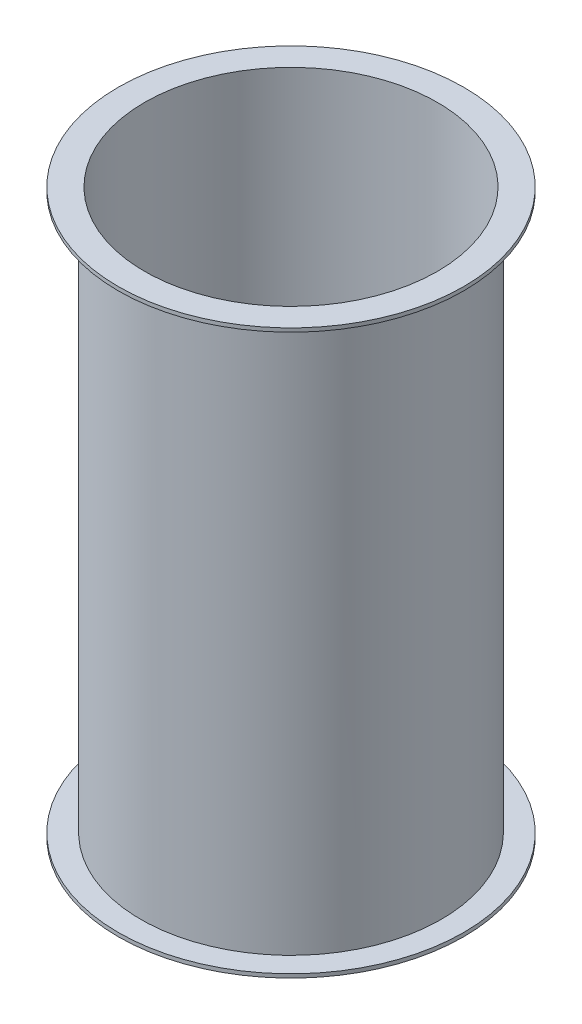
ISO-10303-21;
HEADER;
FILE_DESCRIPTION(('STEP AP214'),'2;1');
FILE_NAME('part.step','',(''),(''),'','','');
FILE_SCHEMA(('AUTOMOTIVE_DESIGN { 1 0 10303 214 1 1 1 1 }'));
ENDSEC;
DATA;
#1=APPLICATION_CONTEXT('core data for automotive mechanical design processes');
#2=APPLICATION_PROTOCOL_DEFINITION('international standard','automotive_design',2000,#1);
#3=PRODUCT_CONTEXT('',#1,'mechanical');
#4=PRODUCT('Part','Part','',(#3));
#5=PRODUCT_RELATED_PRODUCT_CATEGORY('part','',(#4));
#6=PRODUCT_DEFINITION_FORMATION('','',#4);
#7=PRODUCT_DEFINITION_CONTEXT('part definition',#1,'design');
#8=PRODUCT_DEFINITION('design','',#6,#7);
#9=PRODUCT_DEFINITION_SHAPE('','',#8);
#10=(LENGTH_UNIT() NAMED_UNIT(*) SI_UNIT(.MILLI.,.METRE.));
#11=(NAMED_UNIT(*) PLANE_ANGLE_UNIT() SI_UNIT($,.RADIAN.));
#12=(NAMED_UNIT(*) SI_UNIT($,.STERADIAN.) SOLID_ANGLE_UNIT());
#13=UNCERTAINTY_MEASURE_WITH_UNIT(LENGTH_MEASURE(1.E-05),#10,'distance_accuracy_value','');
#14=(GEOMETRIC_REPRESENTATION_CONTEXT(3) GLOBAL_UNCERTAINTY_ASSIGNED_CONTEXT((#13)) GLOBAL_UNIT_ASSIGNED_CONTEXT((#10,
#11,#12)) REPRESENTATION_CONTEXT('',''));
#15=CARTESIAN_POINT('',(0.,0.,0.));
#16=DIRECTION('',(0.,0.,1.));
#17=DIRECTION('',(1.,0.,0.));
#18=AXIS2_PLACEMENT_3D('',#15,#16,#17);
#19=CARTESIAN_POINT('',(0.,150.,0.));
#20=DIRECTION('',(0.,-1.,0.));
#21=DIRECTION('',(0.,0.,-1.));
#22=AXIS2_PLACEMENT_3D('',#19,#20,#21);
#23=CYLINDRICAL_SURFACE('',#22,40.);
#24=CARTESIAN_POINT('',(0.,149.,0.));
#25=DIRECTION('',(0.,1.,0.));
#26=DIRECTION('',(0.,0.,1.));
#27=AXIS2_PLACEMENT_3D('',#24,#25,#26);
#28=CIRCLE('',#27,40.);
#29=CARTESIAN_POINT('',(0.,149.,40.));
#30=VERTEX_POINT('',#29);
#31=EDGE_CURVE('E43',#30,#30,#28,.T.);
#32=ORIENTED_EDGE('',*,*,#31,.F.);
#33=EDGE_LOOP('',(#32));
#34=FACE_BOUND('',#33,.T.);
#35=CARTESIAN_POINT('',(0.,1.,0.));
#36=DIRECTION('',(0.,-1.,0.));
#37=DIRECTION('',(0.,0.,-1.));
#38=AXIS2_PLACEMENT_3D('',#35,#36,#37);
#39=CIRCLE('',#38,40.);
#40=CARTESIAN_POINT('',(0.,1.,-40.));
#41=VERTEX_POINT('',#40);
#42=EDGE_CURVE('E11',#41,#41,#39,.T.);
#43=ORIENTED_EDGE('',*,*,#42,.F.);
#44=EDGE_LOOP('',(#43));
#45=FACE_BOUND('',#44,.T.);
#46=ADVANCED_FACE('F37',(#34,#45),#23,.T.);
#47=CARTESIAN_POINT('',(0.,150.,0.));
#48=DIRECTION('',(0.,1.,0.));
#49=DIRECTION('',(0.,0.,1.));
#50=AXIS2_PLACEMENT_3D('',#47,#48,#49);
#51=PLANE('',#50);
#52=CARTESIAN_POINT('',(0.,150.,0.));
#53=DIRECTION('',(0.,1.,0.));
#54=DIRECTION('',(1.,0.,0.));
#55=AXIS2_PLACEMENT_3D('',#52,#53,#54);
#56=CIRCLE('',#55,39.);
#57=CARTESIAN_POINT('',(39.,150.,0.));
#58=VERTEX_POINT('',#57);
#59=EDGE_CURVE('E47',#58,#58,#56,.T.);
#60=ORIENTED_EDGE('',*,*,#59,.F.);
#61=EDGE_LOOP('',(#60));
#62=FACE_BOUND('',#61,.T.);
#63=CARTESIAN_POINT('',(0.,150.,0.));
#64=DIRECTION('',(0.,1.,0.));
#65=DIRECTION('',(0.,0.,1.));
#66=AXIS2_PLACEMENT_3D('',#63,#64,#65);
#67=CIRCLE('',#66,46.);
#68=CARTESIAN_POINT('',(0.,150.,46.));
#69=VERTEX_POINT('',#68);
#70=EDGE_CURVE('E57',#69,#69,#67,.T.);
#71=ORIENTED_EDGE('',*,*,#70,.T.);
#72=EDGE_LOOP('',(#71));
#73=FACE_BOUND('',#72,.T.);
#74=ADVANCED_FACE('F81',(#62,#73),#51,.T.);
#75=CARTESIAN_POINT('',(0.,0.,0.));
#76=DIRECTION('',(0.,1.,0.));
#77=DIRECTION('',(0.,0.,1.));
#78=AXIS2_PLACEMENT_3D('',#75,#76,#77);
#79=PLANE('',#78);
#80=CARTESIAN_POINT('',(0.,0.,0.));
#81=DIRECTION('',(0.,1.,0.));
#82=DIRECTION('',(1.,0.,0.));
#83=AXIS2_PLACEMENT_3D('',#80,#81,#82);
#84=CIRCLE('',#83,39.);
#85=CARTESIAN_POINT('',(39.,0.,0.));
#86=VERTEX_POINT('',#85);
#87=EDGE_CURVE('E51',#86,#86,#84,.T.);
#88=ORIENTED_EDGE('',*,*,#87,.T.);
#89=EDGE_LOOP('',(#88));
#90=FACE_BOUND('',#89,.T.);
#91=CARTESIAN_POINT('',(0.,0.,0.));
#92=DIRECTION('',(0.,-1.,0.));
#93=DIRECTION('',(0.,0.,-1.));
#94=AXIS2_PLACEMENT_3D('',#91,#92,#93);
#95=CIRCLE('',#94,46.);
#96=CARTESIAN_POINT('',(0.,0.,-46.));
#97=VERTEX_POINT('',#96);
#98=EDGE_CURVE('E63',#97,#97,#95,.T.);
#99=ORIENTED_EDGE('',*,*,#98,.T.);
#100=EDGE_LOOP('',(#99));
#101=FACE_BOUND('',#100,.T.);
#102=ADVANCED_FACE('F86',(#90,#101),#79,.F.);
#103=CARTESIAN_POINT('',(0.,150.,0.));
#104=DIRECTION('',(0.,-1.,0.));
#105=DIRECTION('',(0.,0.,-1.));
#106=AXIS2_PLACEMENT_3D('',#103,#104,#105);
#107=CYLINDRICAL_SURFACE('',#106,39.);
#108=ORIENTED_EDGE('',*,*,#59,.T.);
#109=EDGE_LOOP('',(#108));
#110=FACE_BOUND('',#109,.T.);
#111=ORIENTED_EDGE('',*,*,#87,.F.);
#112=EDGE_LOOP('',(#111));
#113=FACE_BOUND('',#112,.T.);
#114=ADVANCED_FACE('F93',(#110,#113),#107,.F.);
#115=CARTESIAN_POINT('',(0.,149.,0.));
#116=DIRECTION('',(0.,1.,0.));
#117=DIRECTION('',(0.,0.,1.));
#118=AXIS2_PLACEMENT_3D('',#115,#116,#117);
#119=CYLINDRICAL_SURFACE('',#118,46.);
#120=CARTESIAN_POINT('',(0.,149.,0.));
#121=DIRECTION('',(0.,1.,0.));
#122=DIRECTION('',(0.,0.,1.));
#123=AXIS2_PLACEMENT_3D('',#120,#121,#122);
#124=CIRCLE('',#123,46.);
#125=CARTESIAN_POINT('',(0.,149.,46.));
#126=VERTEX_POINT('',#125);
#127=EDGE_CURVE('E55',#126,#126,#124,.T.);
#128=ORIENTED_EDGE('',*,*,#127,.T.);
#129=EDGE_LOOP('',(#128));
#130=FACE_BOUND('',#129,.T.);
#131=ORIENTED_EDGE('',*,*,#70,.F.);
#132=EDGE_LOOP('',(#131));
#133=FACE_BOUND('',#132,.T.);
#134=ADVANCED_FACE('F100',(#130,#133),#119,.T.);
#135=CARTESIAN_POINT('',(0.,149.,0.));
#136=DIRECTION('',(0.,1.,0.));
#137=DIRECTION('',(0.,0.,1.));
#138=AXIS2_PLACEMENT_3D('',#135,#136,#137);
#139=PLANE('',#138);
#140=ORIENTED_EDGE('',*,*,#31,.T.);
#141=EDGE_LOOP('',(#140));
#142=FACE_BOUND('',#141,.T.);
#143=ORIENTED_EDGE('',*,*,#127,.F.);
#144=EDGE_LOOP('',(#143));
#145=FACE_BOUND('',#144,.T.);
#146=ADVANCED_FACE('F78',(#142,#145),#139,.F.);
#147=CARTESIAN_POINT('',(0.,1.,0.));
#148=DIRECTION('',(0.,-1.,0.));
#149=DIRECTION('',(0.,0.,-1.));
#150=AXIS2_PLACEMENT_3D('',#147,#148,#149);
#151=CYLINDRICAL_SURFACE('',#150,46.);
#152=CARTESIAN_POINT('',(0.,1.,0.));
#153=DIRECTION('',(0.,-1.,0.));
#154=DIRECTION('',(0.,0.,-1.));
#155=AXIS2_PLACEMENT_3D('',#152,#153,#154);
#156=CIRCLE('',#155,46.);
#157=CARTESIAN_POINT('',(0.,1.,-46.));
#158=VERTEX_POINT('',#157);
#159=EDGE_CURVE('E60',#158,#158,#156,.T.);
#160=ORIENTED_EDGE('',*,*,#159,.T.);
#161=EDGE_LOOP('',(#160));
#162=FACE_BOUND('',#161,.T.);
#163=ORIENTED_EDGE('',*,*,#98,.F.);
#164=EDGE_LOOP('',(#163));
#165=FACE_BOUND('',#164,.T.);
#166=ADVANCED_FACE('F69',(#162,#165),#151,.T.);
#167=CARTESIAN_POINT('',(0.,1.,0.));
#168=DIRECTION('',(0.,-1.,0.));
#169=DIRECTION('',(0.,0.,-1.));
#170=AXIS2_PLACEMENT_3D('',#167,#168,#169);
#171=PLANE('',#170);
#172=ORIENTED_EDGE('',*,*,#42,.T.);
#173=EDGE_LOOP('',(#172));
#174=FACE_BOUND('',#173,.T.);
#175=ORIENTED_EDGE('',*,*,#159,.F.);
#176=EDGE_LOOP('',(#175));
#177=FACE_BOUND('',#176,.T.);
#178=ADVANCED_FACE('F72',(#174,#177),#171,.F.);
#179=CLOSED_SHELL('',(#46,#74,#102,#114,#134,#146,#166,#178));
#180=MANIFOLD_SOLID_BREP('B2',#179);
#181=ADVANCED_BREP_SHAPE_REPRESENTATION('',(#18,#180),#14);
#182=SHAPE_DEFINITION_REPRESENTATION(#9,#181);
ENDSEC;
END-ISO-10303-21;
